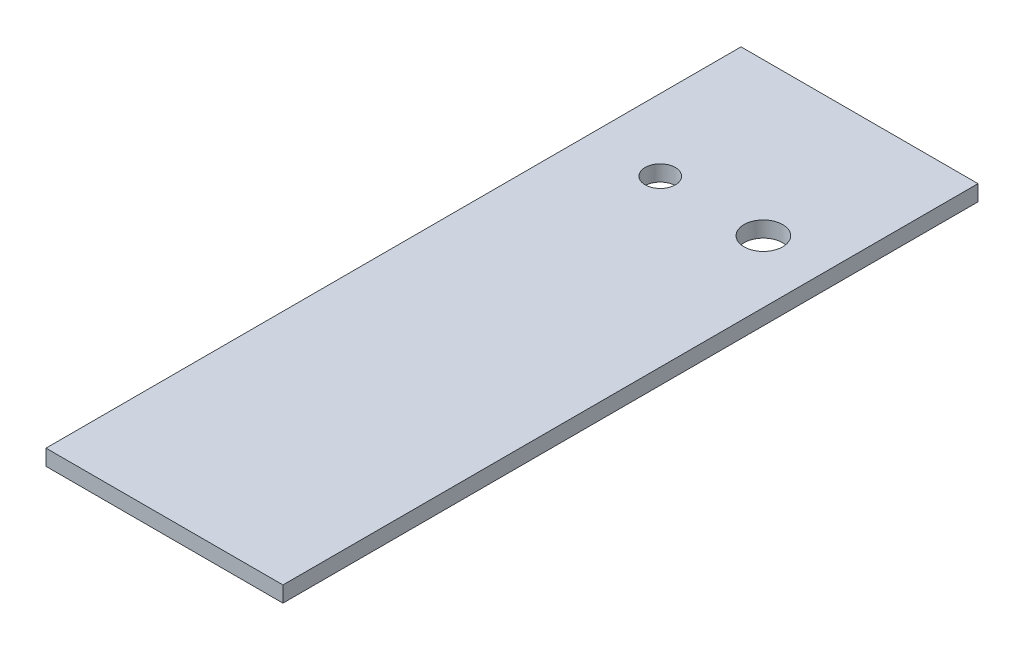
ISO-10303-21;
HEADER;
FILE_DESCRIPTION(('STEP AP214'),'2;1');
FILE_NAME('part.step','',(''),(''),'','','');
FILE_SCHEMA(('AUTOMOTIVE_DESIGN { 1 0 10303 214 1 1 1 1 }'));
ENDSEC;
DATA;
#1=APPLICATION_CONTEXT('core data for automotive mechanical design processes');
#2=APPLICATION_PROTOCOL_DEFINITION('international standard','automotive_design',2000,#1);
#3=PRODUCT_CONTEXT('',#1,'mechanical');
#4=PRODUCT('Part','Part','',(#3));
#5=PRODUCT_RELATED_PRODUCT_CATEGORY('part','',(#4));
#6=PRODUCT_DEFINITION_FORMATION('','',#4);
#7=PRODUCT_DEFINITION_CONTEXT('part definition',#1,'design');
#8=PRODUCT_DEFINITION('design','',#6,#7);
#9=PRODUCT_DEFINITION_SHAPE('','',#8);
#10=(LENGTH_UNIT() NAMED_UNIT(*) SI_UNIT(.MILLI.,.METRE.));
#11=(NAMED_UNIT(*) PLANE_ANGLE_UNIT() SI_UNIT($,.RADIAN.));
#12=(NAMED_UNIT(*) SI_UNIT($,.STERADIAN.) SOLID_ANGLE_UNIT());
#13=UNCERTAINTY_MEASURE_WITH_UNIT(LENGTH_MEASURE(1.E-05),#10,'distance_accuracy_value','');
#14=(GEOMETRIC_REPRESENTATION_CONTEXT(3) GLOBAL_UNCERTAINTY_ASSIGNED_CONTEXT((#13)) GLOBAL_UNIT_ASSIGNED_CONTEXT((#10,
#11,#12)) REPRESENTATION_CONTEXT('',''));
#15=CARTESIAN_POINT('',(0.,0.,0.));
#16=DIRECTION('',(0.,0.,1.));
#17=DIRECTION('',(1.,0.,0.));
#18=AXIS2_PLACEMENT_3D('',#15,#16,#17);
#19=CARTESIAN_POINT('',(0.,6.35,279.4));
#20=DIRECTION('',(0.,1.,0.));
#21=DIRECTION('',(0.,0.,1.));
#22=AXIS2_PLACEMENT_3D('',#19,#20,#21);
#23=PLANE('',#22);
#24=CARTESIAN_POINT('',(28.7824245205741,6.35,61.256853825977));
#25=DIRECTION('',(0.,1.,0.));
#26=DIRECTION('',(0.,0.,1.));
#27=AXIS2_PLACEMENT_3D('',#24,#25,#26);
#28=CIRCLE('',#27,6.06848561693343);
#29=CARTESIAN_POINT('',(28.7824245205741,6.35,67.3253394429104));
#30=VERTEX_POINT('',#29);
#31=EDGE_CURVE('E98',#30,#30,#28,.T.);
#32=ORIENTED_EDGE('',*,*,#31,.F.);
#33=EDGE_LOOP('',(#32));
#34=FACE_BOUND('',#33,.T.);
#35=DIRECTION('',(0.,0.,1.));
#36=VECTOR('',#35,1.);
#37=CARTESIAN_POINT('',(0.,6.35,0.));
#38=LINE('',#37,#36);
#39=CARTESIAN_POINT('',(0.,6.35,0.));
#40=VERTEX_POINT('',#39);
#41=CARTESIAN_POINT('',(0.,6.35,279.4));
#42=VERTEX_POINT('',#41);
#43=EDGE_CURVE('E83',#40,#42,#38,.T.);
#44=ORIENTED_EDGE('',*,*,#43,.T.);
#45=DIRECTION('',(1.,0.,0.));
#46=VECTOR('',#45,1.);
#47=CARTESIAN_POINT('',(0.,6.35,279.4));
#48=LINE('',#47,#46);
#49=CARTESIAN_POINT('',(95.25,6.35,279.4));
#50=VERTEX_POINT('',#49);
#51=EDGE_CURVE('E78',#42,#50,#48,.T.);
#52=ORIENTED_EDGE('',*,*,#51,.T.);
#53=DIRECTION('',(0.,0.,-1.));
#54=VECTOR('',#53,1.);
#55=CARTESIAN_POINT('',(95.25,6.35,0.));
#56=LINE('',#55,#54);
#57=CARTESIAN_POINT('',(95.25,6.35,0.));
#58=VERTEX_POINT('',#57);
#59=EDGE_CURVE('E81',#50,#58,#56,.T.);
#60=ORIENTED_EDGE('',*,*,#59,.T.);
#61=DIRECTION('',(-1.,0.,0.));
#62=VECTOR('',#61,1.);
#63=CARTESIAN_POINT('',(0.,6.35,0.));
#64=LINE('',#63,#62);
#65=EDGE_CURVE('E48',#58,#40,#64,.T.);
#66=ORIENTED_EDGE('',*,*,#65,.T.);
#67=EDGE_LOOP('',(#44,#52,#60,#66));
#68=FACE_BOUND('',#67,.T.);
#69=CARTESIAN_POINT('',(70.2226595268801,6.35,61.256853825977));
#70=DIRECTION('',(0.,1.,0.));
#71=DIRECTION('',(0.,0.,1.));
#72=AXIS2_PLACEMENT_3D('',#69,#70,#71);
#73=CIRCLE('',#72,7.77004406368237);
#74=CARTESIAN_POINT('',(70.2226595268801,6.35,69.0268978896594));
#75=VERTEX_POINT('',#74);
#76=EDGE_CURVE('E113',#75,#75,#73,.T.);
#77=ORIENTED_EDGE('',*,*,#76,.F.);
#78=EDGE_LOOP('',(#77));
#79=FACE_BOUND('',#78,.T.);
#80=ADVANCED_FACE('F31',(#34,#68,#79),#23,.T.);
#81=CARTESIAN_POINT('',(0.,0.,279.4));
#82=DIRECTION('',(0.,1.,0.));
#83=DIRECTION('',(0.,0.,1.));
#84=AXIS2_PLACEMENT_3D('',#81,#82,#83);
#85=PLANE('',#84);
#86=CARTESIAN_POINT('',(28.7824245205741,0.,61.256853825977));
#87=DIRECTION('',(0.,1.,0.));
#88=DIRECTION('',(0.,0.,1.));
#89=AXIS2_PLACEMENT_3D('',#86,#87,#88);
#90=CIRCLE('',#89,6.06848561693343);
#91=CARTESIAN_POINT('',(28.7824245205741,0.,67.3253394429104));
#92=VERTEX_POINT('',#91);
#93=EDGE_CURVE('E110',#92,#92,#90,.T.);
#94=ORIENTED_EDGE('',*,*,#93,.T.);
#95=EDGE_LOOP('',(#94));
#96=FACE_BOUND('',#95,.T.);
#97=DIRECTION('',(0.,0.,1.));
#98=VECTOR('',#97,1.);
#99=CARTESIAN_POINT('',(0.,0.,0.));
#100=LINE('',#99,#98);
#101=CARTESIAN_POINT('',(0.,0.,0.));
#102=VERTEX_POINT('',#101);
#103=CARTESIAN_POINT('',(0.,0.,279.4));
#104=VERTEX_POINT('',#103);
#105=EDGE_CURVE('E95',#102,#104,#100,.T.);
#106=ORIENTED_EDGE('',*,*,#105,.F.);
#107=DIRECTION('',(-1.,0.,0.));
#108=VECTOR('',#107,1.);
#109=CARTESIAN_POINT('',(0.,0.,0.));
#110=LINE('',#109,#108);
#111=CARTESIAN_POINT('',(95.25,0.,0.));
#112=VERTEX_POINT('',#111);
#113=EDGE_CURVE('E71',#112,#102,#110,.T.);
#114=ORIENTED_EDGE('',*,*,#113,.F.);
#115=DIRECTION('',(0.,0.,-1.));
#116=VECTOR('',#115,1.);
#117=CARTESIAN_POINT('',(95.25,0.,0.));
#118=LINE('',#117,#116);
#119=CARTESIAN_POINT('',(95.25,0.,279.4));
#120=VERTEX_POINT('',#119);
#121=EDGE_CURVE('E65',#120,#112,#118,.T.);
#122=ORIENTED_EDGE('',*,*,#121,.F.);
#123=DIRECTION('',(1.,0.,0.));
#124=VECTOR('',#123,1.);
#125=CARTESIAN_POINT('',(0.,0.,279.4));
#126=LINE('',#125,#124);
#127=EDGE_CURVE('E87',#104,#120,#126,.T.);
#128=ORIENTED_EDGE('',*,*,#127,.F.);
#129=EDGE_LOOP('',(#106,#114,#122,#128));
#130=FACE_BOUND('',#129,.T.);
#131=CARTESIAN_POINT('',(70.2226595268801,0.,61.256853825977));
#132=DIRECTION('',(0.,1.,0.));
#133=DIRECTION('',(0.,0.,1.));
#134=AXIS2_PLACEMENT_3D('',#131,#132,#133);
#135=CIRCLE('',#134,7.77004406368237);
#136=CARTESIAN_POINT('',(70.2226595268801,0.,69.0268978896594));
#137=VERTEX_POINT('',#136);
#138=EDGE_CURVE('E116',#137,#137,#135,.T.);
#139=ORIENTED_EDGE('',*,*,#138,.T.);
#140=EDGE_LOOP('',(#139));
#141=FACE_BOUND('',#140,.T.);
#142=ADVANCED_FACE('F106',(#96,#130,#141),#85,.F.);
#143=CARTESIAN_POINT('',(0.,6.35,0.));
#144=DIRECTION('',(1.,0.,0.));
#145=DIRECTION('',(0.,0.,-1.));
#146=AXIS2_PLACEMENT_3D('',#143,#144,#145);
#147=PLANE('',#146);
#148=ORIENTED_EDGE('',*,*,#105,.T.);
#149=DIRECTION('',(0.,-1.,0.));
#150=VECTOR('',#149,1.);
#151=CARTESIAN_POINT('',(0.,6.35,279.4));
#152=LINE('',#151,#150);
#153=EDGE_CURVE('E11',#42,#104,#152,.T.);
#154=ORIENTED_EDGE('',*,*,#153,.F.);
#155=ORIENTED_EDGE('',*,*,#43,.F.);
#156=DIRECTION('',(0.,-1.,0.));
#157=VECTOR('',#156,1.);
#158=CARTESIAN_POINT('',(0.,6.35,0.));
#159=LINE('',#158,#157);
#160=EDGE_CURVE('E91',#40,#102,#159,.T.);
#161=ORIENTED_EDGE('',*,*,#160,.T.);
#162=EDGE_LOOP('',(#148,#154,#155,#161));
#163=FACE_BOUND('',#162,.T.);
#164=ADVANCED_FACE('F33',(#163),#147,.F.);
#165=CARTESIAN_POINT('',(0.,6.35,279.4));
#166=DIRECTION('',(0.,0.,-1.));
#167=DIRECTION('',(-1.,0.,0.));
#168=AXIS2_PLACEMENT_3D('',#165,#166,#167);
#169=PLANE('',#168);
#170=ORIENTED_EDGE('',*,*,#127,.T.);
#171=DIRECTION('',(0.,-1.,0.));
#172=VECTOR('',#171,1.);
#173=CARTESIAN_POINT('',(95.25,6.35,279.4));
#174=LINE('',#173,#172);
#175=EDGE_CURVE('E40',#50,#120,#174,.T.);
#176=ORIENTED_EDGE('',*,*,#175,.F.);
#177=ORIENTED_EDGE('',*,*,#51,.F.);
#178=ORIENTED_EDGE('',*,*,#153,.T.);
#179=EDGE_LOOP('',(#170,#176,#177,#178));
#180=FACE_BOUND('',#179,.T.);
#181=ADVANCED_FACE('F86',(#180),#169,.F.);
#182=CARTESIAN_POINT('',(95.25,6.35,0.));
#183=DIRECTION('',(-1.,0.,0.));
#184=DIRECTION('',(0.,0.,1.));
#185=AXIS2_PLACEMENT_3D('',#182,#183,#184);
#186=PLANE('',#185);
#187=ORIENTED_EDGE('',*,*,#121,.T.);
#188=DIRECTION('',(0.,-1.,0.));
#189=VECTOR('',#188,1.);
#190=CARTESIAN_POINT('',(95.25,6.35,0.));
#191=LINE('',#190,#189);
#192=EDGE_CURVE('E88',#58,#112,#191,.T.);
#193=ORIENTED_EDGE('',*,*,#192,.F.);
#194=ORIENTED_EDGE('',*,*,#59,.F.);
#195=ORIENTED_EDGE('',*,*,#175,.T.);
#196=EDGE_LOOP('',(#187,#193,#194,#195));
#197=FACE_BOUND('',#196,.T.);
#198=ADVANCED_FACE('F89',(#197),#186,.F.);
#199=CARTESIAN_POINT('',(0.,6.35,0.));
#200=DIRECTION('',(0.,0.,1.));
#201=DIRECTION('',(1.,0.,0.));
#202=AXIS2_PLACEMENT_3D('',#199,#200,#201);
#203=PLANE('',#202);
#204=ORIENTED_EDGE('',*,*,#113,.T.);
#205=ORIENTED_EDGE('',*,*,#160,.F.);
#206=ORIENTED_EDGE('',*,*,#65,.F.);
#207=ORIENTED_EDGE('',*,*,#192,.T.);
#208=EDGE_LOOP('',(#204,#205,#206,#207));
#209=FACE_BOUND('',#208,.T.);
#210=ADVANCED_FACE('F103',(#209),#203,.F.);
#211=CARTESIAN_POINT('',(28.7824245205741,6.35,61.256853825977));
#212=DIRECTION('',(0.,-1.,0.));
#213=DIRECTION('',(0.,0.,-1.));
#214=AXIS2_PLACEMENT_3D('',#211,#212,#213);
#215=CYLINDRICAL_SURFACE('',#214,6.06848561693343);
#216=ORIENTED_EDGE('',*,*,#31,.T.);
#217=EDGE_LOOP('',(#216));
#218=FACE_BOUND('',#217,.T.);
#219=ORIENTED_EDGE('',*,*,#93,.F.);
#220=EDGE_LOOP('',(#219));
#221=FACE_BOUND('',#220,.T.);
#222=ADVANCED_FACE('F134',(#218,#221),#215,.F.);
#223=CARTESIAN_POINT('',(70.2226595268801,6.35,61.256853825977));
#224=DIRECTION('',(0.,-1.,0.));
#225=DIRECTION('',(0.,0.,-1.));
#226=AXIS2_PLACEMENT_3D('',#223,#224,#225);
#227=CYLINDRICAL_SURFACE('',#226,7.77004406368237);
#228=ORIENTED_EDGE('',*,*,#76,.T.);
#229=EDGE_LOOP('',(#228));
#230=FACE_BOUND('',#229,.T.);
#231=ORIENTED_EDGE('',*,*,#138,.F.);
#232=EDGE_LOOP('',(#231));
#233=FACE_BOUND('',#232,.T.);
#234=ADVANCED_FACE('F122',(#230,#233),#227,.F.);
#235=CLOSED_SHELL('',(#80,#142,#164,#181,#198,#210,#222,#234));
#236=MANIFOLD_SOLID_BREP('B2',#235);
#237=ADVANCED_BREP_SHAPE_REPRESENTATION('',(#18,#236),#14);
#238=SHAPE_DEFINITION_REPRESENTATION(#9,#237);
ENDSEC;
END-ISO-10303-21;
